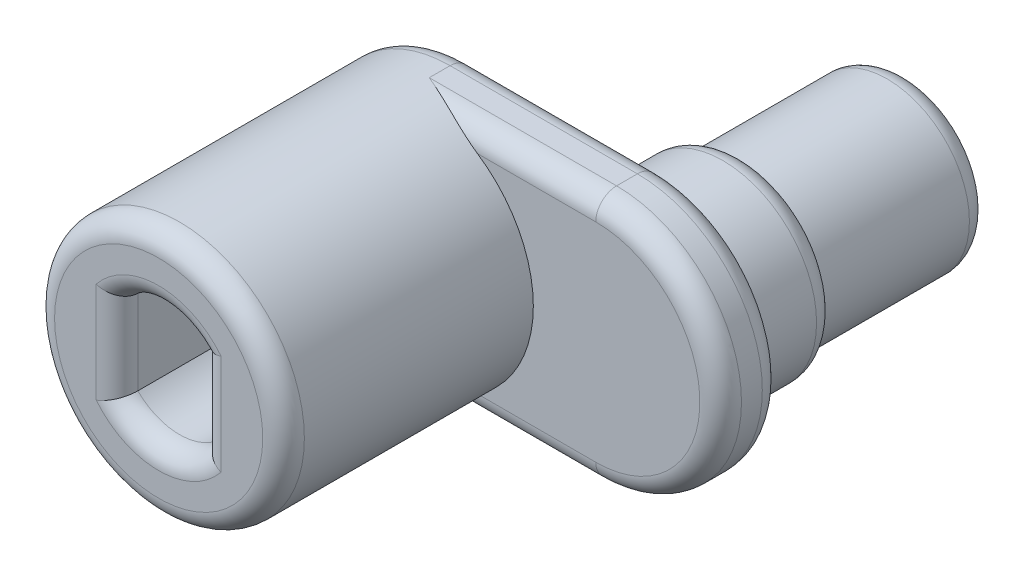
ISO-10303-21;
HEADER;
FILE_DESCRIPTION(('STEP AP214'),'2;1');
FILE_NAME('part.step','',(''),(''),'','','');
FILE_SCHEMA(('AUTOMOTIVE_DESIGN { 1 0 10303 214 1 1 1 1 }'));
ENDSEC;
DATA;
#1=APPLICATION_CONTEXT('core data for automotive mechanical design processes');
#2=APPLICATION_PROTOCOL_DEFINITION('international standard','automotive_design',2000,#1);
#3=PRODUCT_CONTEXT('',#1,'mechanical');
#4=PRODUCT('Part','Part','',(#3));
#5=PRODUCT_RELATED_PRODUCT_CATEGORY('part','',(#4));
#6=PRODUCT_DEFINITION_FORMATION('','',#4);
#7=PRODUCT_DEFINITION_CONTEXT('part definition',#1,'design');
#8=PRODUCT_DEFINITION('design','',#6,#7);
#9=PRODUCT_DEFINITION_SHAPE('','',#8);
#10=(LENGTH_UNIT() NAMED_UNIT(*) SI_UNIT(.MILLI.,.METRE.));
#11=(NAMED_UNIT(*) PLANE_ANGLE_UNIT() SI_UNIT($,.RADIAN.));
#12=(NAMED_UNIT(*) SI_UNIT($,.STERADIAN.) SOLID_ANGLE_UNIT());
#13=UNCERTAINTY_MEASURE_WITH_UNIT(LENGTH_MEASURE(1.E-05),#10,'distance_accuracy_value','');
#14=(GEOMETRIC_REPRESENTATION_CONTEXT(3) GLOBAL_UNCERTAINTY_ASSIGNED_CONTEXT((#13)) GLOBAL_UNIT_ASSIGNED_CONTEXT((#10,
#11,#12)) REPRESENTATION_CONTEXT('',''));
#15=CARTESIAN_POINT('',(0.,0.,0.));
#16=DIRECTION('',(0.,0.,1.));
#17=DIRECTION('',(1.,0.,0.));
#18=AXIS2_PLACEMENT_3D('',#15,#16,#17);
#19=CARTESIAN_POINT('',(-9.,0.,3.));
#20=DIRECTION('',(0.,0.,-1.));
#21=DIRECTION('',(-1.,0.,0.));
#22=AXIS2_PLACEMENT_3D('',#19,#20,#21);
#23=CYLINDRICAL_SURFACE('',#22,2.85);
#24=DIRECTION('',(0.,0.,-1.));
#25=VECTOR('',#24,1.);
#26=CARTESIAN_POINT('',(-11.,-2.03039405042469,3.));
#27=LINE('',#26,#25);
#28=CARTESIAN_POINT('',(-11.,-2.03039405042469,14.));
#29=VERTEX_POINT('',#28);
#30=CARTESIAN_POINT('',(-11.,-2.03039405042469,4.));
#31=VERTEX_POINT('',#30);
#32=EDGE_CURVE('E191',#29,#31,#27,.T.);
#33=ORIENTED_EDGE('',*,*,#32,.F.);
#34=CARTESIAN_POINT('',(-9.,0.,14.));
#35=DIRECTION('',(0.,0.,1.));
#36=DIRECTION('',(1.,0.,0.));
#37=AXIS2_PLACEMENT_3D('',#34,#35,#36);
#38=CIRCLE('',#37,2.85);
#39=CARTESIAN_POINT('',(-7.,-2.0303940504247,14.));
#40=VERTEX_POINT('',#39);
#41=EDGE_CURVE('E256',#29,#40,#38,.T.);
#42=ORIENTED_EDGE('',*,*,#41,.T.);
#43=DIRECTION('',(0.,0.,-1.));
#44=VECTOR('',#43,1.);
#45=CARTESIAN_POINT('',(-7.,-2.0303940504247,3.));
#46=LINE('',#45,#44);
#47=CARTESIAN_POINT('',(-7.,-2.0303940504247,4.));
#48=VERTEX_POINT('',#47);
#49=EDGE_CURVE('E162',#40,#48,#46,.T.);
#50=ORIENTED_EDGE('',*,*,#49,.T.);
#51=CARTESIAN_POINT('',(-9.,0.,4.));
#52=DIRECTION('',(0.,0.,1.));
#53=DIRECTION('',(1.,0.,0.));
#54=AXIS2_PLACEMENT_3D('',#51,#52,#53);
#55=CIRCLE('',#54,2.85);
#56=EDGE_CURVE('E172',#31,#48,#55,.T.);
#57=ORIENTED_EDGE('',*,*,#56,.F.);
#58=EDGE_LOOP('',(#33,#42,#50,#57));
#59=FACE_BOUND('',#58,.T.);
#60=ADVANCED_FACE('F43',(#59),#23,.F.);
#61=CARTESIAN_POINT('',(-11.,0.,3.));
#62=DIRECTION('',(-1.,0.,0.));
#63=DIRECTION('',(0.,0.,1.));
#64=AXIS2_PLACEMENT_3D('',#61,#62,#63);
#65=PLANE('',#64);
#66=DIRECTION('',(0.,0.,-1.));
#67=VECTOR('',#66,1.);
#68=CARTESIAN_POINT('',(-11.,2.03039405042469,3.));
#69=LINE('',#68,#67);
#70=CARTESIAN_POINT('',(-11.,2.03039405042469,14.));
#71=VERTEX_POINT('',#70);
#72=CARTESIAN_POINT('',(-11.,2.03039405042469,4.));
#73=VERTEX_POINT('',#72);
#74=EDGE_CURVE('E158',#71,#73,#69,.T.);
#75=ORIENTED_EDGE('',*,*,#74,.F.);
#76=DIRECTION('',(0.,1.,0.));
#77=VECTOR('',#76,1.);
#78=CARTESIAN_POINT('',(-11.,-2.03039405042469,14.));
#79=LINE('',#78,#77);
#80=EDGE_CURVE('E63',#71,#29,#79,.F.);
#81=ORIENTED_EDGE('',*,*,#80,.T.);
#82=ORIENTED_EDGE('',*,*,#32,.T.);
#83=DIRECTION('',(0.,1.,0.));
#84=VECTOR('',#83,1.);
#85=CARTESIAN_POINT('',(-11.,0.,4.));
#86=LINE('',#85,#84);
#87=EDGE_CURVE('E174',#31,#73,#86,.T.);
#88=ORIENTED_EDGE('',*,*,#87,.T.);
#89=EDGE_LOOP('',(#75,#81,#82,#88));
#90=FACE_BOUND('',#89,.T.);
#91=ADVANCED_FACE('F292',(#90),#65,.F.);
#92=CARTESIAN_POINT('',(-9.,0.,3.));
#93=DIRECTION('',(0.,0.,-1.));
#94=DIRECTION('',(-1.,0.,0.));
#95=AXIS2_PLACEMENT_3D('',#92,#93,#94);
#96=CYLINDRICAL_SURFACE('',#95,2.85);
#97=DIRECTION('',(0.,0.,-1.));
#98=VECTOR('',#97,1.);
#99=CARTESIAN_POINT('',(-7.,2.0303940504247,3.));
#100=LINE('',#99,#98);
#101=CARTESIAN_POINT('',(-7.,2.0303940504247,14.));
#102=VERTEX_POINT('',#101);
#103=CARTESIAN_POINT('',(-7.,2.0303940504247,4.));
#104=VERTEX_POINT('',#103);
#105=EDGE_CURVE('E151',#102,#104,#100,.T.);
#106=ORIENTED_EDGE('',*,*,#105,.F.);
#107=CARTESIAN_POINT('',(-9.,0.,14.));
#108=DIRECTION('',(0.,0.,1.));
#109=DIRECTION('',(1.,0.,0.));
#110=AXIS2_PLACEMENT_3D('',#107,#108,#109);
#111=CIRCLE('',#110,2.85);
#112=EDGE_CURVE('E72',#102,#71,#111,.T.);
#113=ORIENTED_EDGE('',*,*,#112,.T.);
#114=ORIENTED_EDGE('',*,*,#74,.T.);
#115=CARTESIAN_POINT('',(-9.,0.,4.));
#116=DIRECTION('',(0.,0.,1.));
#117=DIRECTION('',(1.,0.,0.));
#118=AXIS2_PLACEMENT_3D('',#115,#116,#117);
#119=CIRCLE('',#118,2.85);
#120=EDGE_CURVE('E161',#104,#73,#119,.T.);
#121=ORIENTED_EDGE('',*,*,#120,.F.);
#122=EDGE_LOOP('',(#106,#113,#114,#121));
#123=FACE_BOUND('',#122,.T.);
#124=ADVANCED_FACE('F163',(#123),#96,.F.);
#125=CARTESIAN_POINT('',(0.,6.,3.));
#126=DIRECTION('',(0.,-1.,0.));
#127=DIRECTION('',(0.,0.,-1.));
#128=AXIS2_PLACEMENT_3D('',#125,#126,#127);
#129=PLANE('',#128);
#130=DIRECTION('',(0.,0.,-1.));
#131=VECTOR('',#130,1.);
#132=CARTESIAN_POINT('',(0.,6.,3.));
#133=LINE('',#132,#131);
#134=CARTESIAN_POINT('',(0.,6.,2.));
#135=VERTEX_POINT('',#134);
#136=CARTESIAN_POINT('',(0.,6.,1.));
#137=VERTEX_POINT('',#136);
#138=EDGE_CURVE('E190',#135,#137,#133,.T.);
#139=ORIENTED_EDGE('',*,*,#138,.T.);
#140=DIRECTION('',(-1.,0.,0.));
#141=VECTOR('',#140,1.);
#142=CARTESIAN_POINT('',(0.,6.,1.));
#143=LINE('',#142,#141);
#144=CARTESIAN_POINT('',(-9.,6.,1.));
#145=VERTEX_POINT('',#144);
#146=EDGE_CURVE('E216',#137,#145,#143,.T.);
#147=ORIENTED_EDGE('',*,*,#146,.T.);
#148=DIRECTION('',(0.,0.,-1.));
#149=VECTOR('',#148,1.);
#150=CARTESIAN_POINT('',(-9.,6.,3.));
#151=LINE('',#150,#149);
#152=CARTESIAN_POINT('',(-9.,6.,2.));
#153=VERTEX_POINT('',#152);
#154=EDGE_CURVE('E186',#153,#145,#151,.T.);
#155=ORIENTED_EDGE('',*,*,#154,.F.);
#156=DIRECTION('',(-1.,0.,0.));
#157=VECTOR('',#156,1.);
#158=CARTESIAN_POINT('',(0.,6.,2.));
#159=LINE('',#158,#157);
#160=EDGE_CURVE('E211',#153,#135,#159,.F.);
#161=ORIENTED_EDGE('',*,*,#160,.T.);
#162=EDGE_LOOP('',(#139,#147,#155,#161));
#163=FACE_BOUND('',#162,.T.);
#164=ADVANCED_FACE('F281',(#163),#129,.F.);
#165=CARTESIAN_POINT('',(-9.,0.,3.));
#166=DIRECTION('',(0.,0.,-1.));
#167=DIRECTION('',(-1.,0.,0.));
#168=AXIS2_PLACEMENT_3D('',#165,#166,#167);
#169=CYLINDRICAL_SURFACE('',#168,6.);
#170=CARTESIAN_POINT('',(-9.,0.,14.));
#171=DIRECTION('',(0.,0.,1.));
#172=DIRECTION('',(1.,0.,0.));
#173=AXIS2_PLACEMENT_3D('',#170,#171,#172);
#174=CIRCLE('',#173,6.);
#175=CARTESIAN_POINT('',(-3.,0.,14.));
#176=VERTEX_POINT('',#175);
#177=EDGE_CURVE('E255',#176,#176,#174,.F.);
#178=ORIENTED_EDGE('',*,*,#177,.T.);
#179=EDGE_LOOP('',(#178));
#180=FACE_BOUND('',#179,.T.);
#181=ORIENTED_EDGE('',*,*,#154,.T.);
#182=CARTESIAN_POINT('',(-9.,0.,1.));
#183=DIRECTION('',(0.,0.,1.));
#184=DIRECTION('',(1.,0.,0.));
#185=AXIS2_PLACEMENT_3D('',#182,#183,#184);
#186=CIRCLE('',#185,6.);
#187=CARTESIAN_POINT('',(-9.,-6.,1.));
#188=VERTEX_POINT('',#187);
#189=EDGE_CURVE('E249',#145,#188,#186,.T.);
#190=ORIENTED_EDGE('',*,*,#189,.T.);
#191=DIRECTION('',(0.,0.,-1.));
#192=VECTOR('',#191,1.);
#193=CARTESIAN_POINT('',(-9.,-6.,3.));
#194=LINE('',#193,#192);
#195=CARTESIAN_POINT('',(-9.,-6.,2.));
#196=VERTEX_POINT('',#195);
#197=EDGE_CURVE('E197',#196,#188,#194,.T.);
#198=ORIENTED_EDGE('',*,*,#197,.F.);
#199=CARTESIAN_POINT('',(-5.68337520964461,-5.,3.));
#200=CARTESIAN_POINT('',(-5.7541107496535,-5.04693073718608,2.99996088985897));
#201=CARTESIAN_POINT('',(-5.82578928514933,-5.09230552866443,2.99670012924773));
#202=CARTESIAN_POINT('',(-5.97055707879883,-5.17972843111877,2.98471287105526));
#203=CARTESIAN_POINT('',(-6.04364391342487,-5.22178171538329,2.97599506979339));
#204=CARTESIAN_POINT('',(-6.19059189468272,-5.3022841991124,2.9541228058013));
#205=CARTESIAN_POINT('',(-6.26444692922391,-5.34075122750363,2.94099197118298));
#206=CARTESIAN_POINT('',(-6.41310840932028,-5.41432119569905,2.91099767206763));
#207=CARTESIAN_POINT('',(-6.48791537667021,-5.44942219177048,2.89413206928888));
#208=CARTESIAN_POINT('',(-6.69893580797272,-5.54321172794869,2.84242522003985));
#209=CARTESIAN_POINT('',(-6.8359981187838,-5.59808248534124,2.80405950269348));
#210=CARTESIAN_POINT('',(-7.11176438315576,-5.69702137805394,2.71998314396154));
#211=CARTESIAN_POINT('',(-7.25046919667064,-5.74108356617588,2.67426848176229));
#212=CARTESIAN_POINT('',(-7.5294273439826,-5.81880111828429,2.5774342802611));
#213=CARTESIAN_POINT('',(-7.6696842677544,-5.85242182237547,2.52629748021286));
#214=CARTESIAN_POINT('',(-7.95085993750273,-5.90930382157744,2.42044575684157));
#215=CARTESIAN_POINT('',(-8.09177838113347,-5.93256945692709,2.36573234367465));
#216=CARTESIAN_POINT('',(-8.35824382334687,-5.96691885342722,2.26035658078792));
#217=CARTESIAN_POINT('',(-8.48374708715462,-5.9790741295418,2.20992564892179));
#218=CARTESIAN_POINT('',(-8.73472825039764,-5.99544962953236,2.10828172718314));
#219=CARTESIAN_POINT('',(-8.86020584499788,-5.99968301433478,2.05707017716895));
#220=CARTESIAN_POINT('',(-8.99043820652584,-5.99999428411862,2.00390358532528));
#221=CARTESIAN_POINT('',(-8.9952191255371,-5.99999999815974,2.00195178315622));
#222=CARTESIAN_POINT('',(-9.,-6.,2.));
#223=B_SPLINE_CURVE_WITH_KNOTS('',3,(#199,#200,#201,#202,#203,#204,#205,#206,#207,#208,#209,
#210,#211,#212,#213,#214,#215,#216,#217,#218,#219,#220,#221,#222),.UNSPECIFIED.,.F.,.F.,(4,2,2,
2,2,2,2,2,2,2,2,4),(0.,0.254478765589245,0.50855302360644,0.761288041690582,1.01416813500991,
1.47107229962261,1.92822730548719,2.38688397976839,2.84534823055555,3.25253093781937,
3.65903657498634,3.6745285178593),.UNSPECIFIED.);
#224=CARTESIAN_POINT('',(-5.68337520964461,-5.,3.));
#225=VERTEX_POINT('',#224);
#226=EDGE_CURVE('E60',#196,#225,#223,.F.);
#227=ORIENTED_EDGE('',*,*,#226,.T.);
#228=CARTESIAN_POINT('',(-9.,0.,3.));
#229=DIRECTION('',(0.,0.,1.));
#230=DIRECTION('',(1.,0.,0.));
#231=AXIS2_PLACEMENT_3D('',#228,#229,#230);
#232=CIRCLE('',#231,6.);
#233=CARTESIAN_POINT('',(-5.68337520964461,5.,3.));
#234=VERTEX_POINT('',#233);
#235=EDGE_CURVE('E182',#234,#225,#232,.F.);
#236=ORIENTED_EDGE('',*,*,#235,.F.);
#237=CARTESIAN_POINT('',(-5.68337520964461,5.,3.));
#238=CARTESIAN_POINT('',(-5.7541107496535,5.04693073718608,2.99996088985897));
#239=CARTESIAN_POINT('',(-5.82578928514933,5.09230552866443,2.99670012924773));
#240=CARTESIAN_POINT('',(-5.97055707879883,5.17972843111877,2.98471287105526));
#241=CARTESIAN_POINT('',(-6.04364391342487,5.22178171538329,2.97599506979339));
#242=CARTESIAN_POINT('',(-6.19059189468272,5.3022841991124,2.9541228058013));
#243=CARTESIAN_POINT('',(-6.26444692922391,5.34075122750363,2.94099197118298));
#244=CARTESIAN_POINT('',(-6.41310840932028,5.41432119569905,2.91099767206763));
#245=CARTESIAN_POINT('',(-6.48791537667021,5.44942219177048,2.89413206928888));
#246=CARTESIAN_POINT('',(-6.69893580797272,5.54321172794869,2.84242522003985));
#247=CARTESIAN_POINT('',(-6.8359981187838,5.59808248534124,2.80405950269348));
#248=CARTESIAN_POINT('',(-7.11176438315576,5.69702137805394,2.71998314396154));
#249=CARTESIAN_POINT('',(-7.25046919667064,5.74108356617588,2.67426848176229));
#250=CARTESIAN_POINT('',(-7.5294273439826,5.81880111828429,2.5774342802611));
#251=CARTESIAN_POINT('',(-7.6696842677544,5.85242182237547,2.52629748021286));
#252=CARTESIAN_POINT('',(-7.95085993750273,5.90930382157744,2.42044575684157));
#253=CARTESIAN_POINT('',(-8.09177838113347,5.93256945692709,2.36573234367465));
#254=CARTESIAN_POINT('',(-8.35824382334687,5.96691885342722,2.26035658078792));
#255=CARTESIAN_POINT('',(-8.48374708715462,5.9790741295418,2.20992564892179));
#256=CARTESIAN_POINT('',(-8.73472825039764,5.99544962953236,2.10828172718314));
#257=CARTESIAN_POINT('',(-8.86020584499788,5.99968301433478,2.05707017716895));
#258=CARTESIAN_POINT('',(-8.99043820652584,5.99999428411862,2.00390358532528));
#259=CARTESIAN_POINT('',(-8.9952191255371,5.99999999815974,2.00195178315622));
#260=CARTESIAN_POINT('',(-9.,6.,2.));
#261=B_SPLINE_CURVE_WITH_KNOTS('',3,(#237,#238,#239,#240,#241,#242,#243,#244,#245,#246,#247,
#248,#249,#250,#251,#252,#253,#254,#255,#256,#257,#258,#259,#260),.UNSPECIFIED.,.F.,.F.,(4,2,2,
2,2,2,2,2,2,2,2,4),(0.,0.254478765589245,0.50855302360644,0.761288041690582,1.01416813500991,
1.47107229962261,1.92822730548719,2.38688397976839,2.84534823055555,3.25253093781937,
3.65903657498634,3.6745285178593),.UNSPECIFIED.);
#262=EDGE_CURVE('E11',#234,#153,#261,.T.);
#263=ORIENTED_EDGE('',*,*,#262,.T.);
#264=EDGE_LOOP('',(#181,#190,#198,#227,#236,#263));
#265=FACE_BOUND('',#264,.T.);
#266=ADVANCED_FACE('F278',(#180,#265),#169,.T.);
#267=CARTESIAN_POINT('',(0.,-6.,3.));
#268=DIRECTION('',(0.,1.,0.));
#269=DIRECTION('',(0.,0.,1.));
#270=AXIS2_PLACEMENT_3D('',#267,#268,#269);
#271=PLANE('',#270);
#272=DIRECTION('',(0.,0.,-1.));
#273=VECTOR('',#272,1.);
#274=CARTESIAN_POINT('',(0.,-6.,3.));
#275=LINE('',#274,#273);
#276=CARTESIAN_POINT('',(0.,-6.,2.));
#277=VERTEX_POINT('',#276);
#278=CARTESIAN_POINT('',(0.,-6.,1.));
#279=VERTEX_POINT('',#278);
#280=EDGE_CURVE('E196',#277,#279,#275,.T.);
#281=ORIENTED_EDGE('',*,*,#280,.F.);
#282=DIRECTION('',(1.,0.,0.));
#283=VECTOR('',#282,1.);
#284=CARTESIAN_POINT('',(-9.,-6.,2.));
#285=LINE('',#284,#283);
#286=EDGE_CURVE('E215',#277,#196,#285,.F.);
#287=ORIENTED_EDGE('',*,*,#286,.T.);
#288=ORIENTED_EDGE('',*,*,#197,.T.);
#289=DIRECTION('',(1.,0.,0.));
#290=VECTOR('',#289,1.);
#291=CARTESIAN_POINT('',(0.,-6.,1.));
#292=LINE('',#291,#290);
#293=EDGE_CURVE('E208',#188,#279,#292,.T.);
#294=ORIENTED_EDGE('',*,*,#293,.T.);
#295=EDGE_LOOP('',(#281,#287,#288,#294));
#296=FACE_BOUND('',#295,.T.);
#297=ADVANCED_FACE('F284',(#296),#271,.F.);
#298=CARTESIAN_POINT('',(0.,0.,3.));
#299=DIRECTION('',(0.,0.,-1.));
#300=DIRECTION('',(-1.,0.,0.));
#301=AXIS2_PLACEMENT_3D('',#298,#299,#300);
#302=CYLINDRICAL_SURFACE('',#301,6.);
#303=ORIENTED_EDGE('',*,*,#280,.T.);
#304=CARTESIAN_POINT('',(0.,0.,1.));
#305=DIRECTION('',(0.,0.,1.));
#306=DIRECTION('',(1.,0.,0.));
#307=AXIS2_PLACEMENT_3D('',#304,#305,#306);
#308=CIRCLE('',#307,6.);
#309=EDGE_CURVE('E229',#279,#137,#308,.T.);
#310=ORIENTED_EDGE('',*,*,#309,.T.);
#311=ORIENTED_EDGE('',*,*,#138,.F.);
#312=CARTESIAN_POINT('',(0.,0.,2.));
#313=DIRECTION('',(0.,0.,1.));
#314=DIRECTION('',(1.,0.,0.));
#315=AXIS2_PLACEMENT_3D('',#312,#313,#314);
#316=CIRCLE('',#315,6.);
#317=EDGE_CURVE('E227',#135,#277,#316,.F.);
#318=ORIENTED_EDGE('',*,*,#317,.T.);
#319=EDGE_LOOP('',(#303,#310,#311,#318));
#320=FACE_BOUND('',#319,.T.);
#321=ADVANCED_FACE('F302',(#320),#302,.T.);
#322=CARTESIAN_POINT('',(-7.,0.,3.));
#323=DIRECTION('',(-1.,0.,0.));
#324=DIRECTION('',(0.,0.,1.));
#325=AXIS2_PLACEMENT_3D('',#322,#323,#324);
#326=PLANE('',#325);
#327=ORIENTED_EDGE('',*,*,#49,.F.);
#328=DIRECTION('',(0.,1.,0.));
#329=VECTOR('',#328,1.);
#330=CARTESIAN_POINT('',(-7.,0.,14.));
#331=LINE('',#330,#329);
#332=EDGE_CURVE('E159',#40,#102,#331,.T.);
#333=ORIENTED_EDGE('',*,*,#332,.T.);
#334=ORIENTED_EDGE('',*,*,#105,.T.);
#335=DIRECTION('',(0.,1.,0.));
#336=VECTOR('',#335,1.);
#337=CARTESIAN_POINT('',(-7.,0.,4.));
#338=LINE('',#337,#336);
#339=EDGE_CURVE('E157',#48,#104,#338,.T.);
#340=ORIENTED_EDGE('',*,*,#339,.F.);
#341=EDGE_LOOP('',(#327,#333,#334,#340));
#342=FACE_BOUND('',#341,.T.);
#343=ADVANCED_FACE('F153',(#342),#326,.T.);
#344=CARTESIAN_POINT('',(0.,0.,3.));
#345=DIRECTION('',(0.,0.,1.));
#346=DIRECTION('',(1.,0.,0.));
#347=AXIS2_PLACEMENT_3D('',#344,#345,#346);
#348=PLANE('',#347);
#349=ORIENTED_EDGE('',*,*,#235,.T.);
#350=DIRECTION('',(1.,0.,0.));
#351=VECTOR('',#350,1.);
#352=CARTESIAN_POINT('',(0.,-5.,3.));
#353=LINE('',#352,#351);
#354=CARTESIAN_POINT('',(0.,-5.,3.));
#355=VERTEX_POINT('',#354);
#356=EDGE_CURVE('E210',#225,#355,#353,.T.);
#357=ORIENTED_EDGE('',*,*,#356,.T.);
#358=CARTESIAN_POINT('',(0.,0.,3.));
#359=DIRECTION('',(0.,0.,1.));
#360=DIRECTION('',(1.,0.,0.));
#361=AXIS2_PLACEMENT_3D('',#358,#359,#360);
#362=CIRCLE('',#361,5.);
#363=CARTESIAN_POINT('',(0.,5.,3.));
#364=VERTEX_POINT('',#363);
#365=EDGE_CURVE('E204',#355,#364,#362,.T.);
#366=ORIENTED_EDGE('',*,*,#365,.T.);
#367=DIRECTION('',(-1.,0.,0.));
#368=VECTOR('',#367,1.);
#369=CARTESIAN_POINT('',(-9.,5.,3.));
#370=LINE('',#369,#368);
#371=EDGE_CURVE('E193',#364,#234,#370,.T.);
#372=ORIENTED_EDGE('',*,*,#371,.T.);
#373=EDGE_LOOP('',(#349,#357,#366,#372));
#374=FACE_BOUND('',#373,.T.);
#375=ADVANCED_FACE('F308',(#374),#348,.T.);
#376=CARTESIAN_POINT('',(0.,0.,0.));
#377=DIRECTION('',(0.,0.,1.));
#378=DIRECTION('',(1.,0.,0.));
#379=AXIS2_PLACEMENT_3D('',#376,#377,#378);
#380=PLANE('',#379);
#381=CARTESIAN_POINT('',(-9.,0.,0.));
#382=DIRECTION('',(0.,0.,1.));
#383=DIRECTION('',(1.,0.,0.));
#384=AXIS2_PLACEMENT_3D('',#381,#382,#383);
#385=CIRCLE('',#384,5.);
#386=CARTESIAN_POINT('',(-9.,-5.,0.));
#387=VERTEX_POINT('',#386);
#388=CARTESIAN_POINT('',(-9.,5.,0.));
#389=VERTEX_POINT('',#388);
#390=EDGE_CURVE('E218',#387,#389,#385,.F.);
#391=ORIENTED_EDGE('',*,*,#390,.T.);
#392=DIRECTION('',(-1.,0.,0.));
#393=VECTOR('',#392,1.);
#394=CARTESIAN_POINT('',(0.,5.,0.));
#395=LINE('',#394,#393);
#396=CARTESIAN_POINT('',(0.,5.,0.));
#397=VERTEX_POINT('',#396);
#398=EDGE_CURVE('E224',#389,#397,#395,.F.);
#399=ORIENTED_EDGE('',*,*,#398,.T.);
#400=CARTESIAN_POINT('',(0.,0.,0.));
#401=DIRECTION('',(0.,0.,1.));
#402=DIRECTION('',(1.,0.,0.));
#403=AXIS2_PLACEMENT_3D('',#400,#401,#402);
#404=CIRCLE('',#403,5.);
#405=CARTESIAN_POINT('',(0.,-5.,0.));
#406=VERTEX_POINT('',#405);
#407=EDGE_CURVE('E222',#397,#406,#404,.F.);
#408=ORIENTED_EDGE('',*,*,#407,.T.);
#409=DIRECTION('',(1.,0.,0.));
#410=VECTOR('',#409,1.);
#411=CARTESIAN_POINT('',(0.,-5.,0.));
#412=LINE('',#411,#410);
#413=EDGE_CURVE('E221',#406,#387,#412,.F.);
#414=ORIENTED_EDGE('',*,*,#413,.T.);
#415=EDGE_LOOP('',(#391,#399,#408,#414));
#416=FACE_BOUND('',#415,.T.);
#417=CARTESIAN_POINT('',(0.,0.,0.));
#418=DIRECTION('',(0.,0.,1.));
#419=DIRECTION('',(1.,0.,0.));
#420=AXIS2_PLACEMENT_3D('',#417,#418,#419);
#421=CIRCLE('',#420,4.5);
#422=CARTESIAN_POINT('',(4.5,0.,0.));
#423=VERTEX_POINT('',#422);
#424=EDGE_CURVE('E168',#423,#423,#421,.T.);
#425=ORIENTED_EDGE('',*,*,#424,.T.);
#426=EDGE_LOOP('',(#425));
#427=FACE_BOUND('',#426,.T.);
#428=ADVANCED_FACE('F439',(#416,#427),#380,.F.);
#429=CARTESIAN_POINT('',(0.,0.,15.));
#430=DIRECTION('',(0.,0.,1.));
#431=DIRECTION('',(1.,0.,0.));
#432=AXIS2_PLACEMENT_3D('',#429,#430,#431);
#433=PLANE('',#432);
#434=CARTESIAN_POINT('',(-9.,0.,15.));
#435=DIRECTION('',(0.,0.,1.));
#436=DIRECTION('',(1.,0.,0.));
#437=AXIS2_PLACEMENT_3D('',#434,#435,#436);
#438=CIRCLE('',#437,5.);
#439=CARTESIAN_POINT('',(-4.,0.,15.));
#440=VERTEX_POINT('',#439);
#441=EDGE_CURVE('E250',#440,#440,#438,.T.);
#442=ORIENTED_EDGE('',*,*,#441,.T.);
#443=EDGE_LOOP('',(#442));
#444=FACE_BOUND('',#443,.T.);
#445=CARTESIAN_POINT('',(-9.,0.,15.));
#446=DIRECTION('',(0.,0.,1.));
#447=DIRECTION('',(1.,0.,0.));
#448=AXIS2_PLACEMENT_3D('',#445,#446,#447);
#449=CIRCLE('',#448,3.85);
#450=CARTESIAN_POINT('',(-12.,2.41298570240273,15.));
#451=VERTEX_POINT('',#450);
#452=CARTESIAN_POINT('',(-6.,2.41298570240273,15.));
#453=VERTEX_POINT('',#452);
#454=EDGE_CURVE('E245',#451,#453,#449,.F.);
#455=ORIENTED_EDGE('',*,*,#454,.T.);
#456=DIRECTION('',(0.,1.,0.));
#457=VECTOR('',#456,1.);
#458=CARTESIAN_POINT('',(-6.,0.,15.));
#459=LINE('',#458,#457);
#460=CARTESIAN_POINT('',(-6.,-2.41298570240273,15.));
#461=VERTEX_POINT('',#460);
#462=EDGE_CURVE('E243',#453,#461,#459,.F.);
#463=ORIENTED_EDGE('',*,*,#462,.T.);
#464=CARTESIAN_POINT('',(-9.,0.,15.));
#465=DIRECTION('',(0.,0.,1.));
#466=DIRECTION('',(1.,0.,0.));
#467=AXIS2_PLACEMENT_3D('',#464,#465,#466);
#468=CIRCLE('',#467,3.85);
#469=CARTESIAN_POINT('',(-12.,-2.41298570240273,15.));
#470=VERTEX_POINT('',#469);
#471=EDGE_CURVE('E239',#461,#470,#468,.F.);
#472=ORIENTED_EDGE('',*,*,#471,.T.);
#473=DIRECTION('',(0.,1.,0.));
#474=VECTOR('',#473,1.);
#475=CARTESIAN_POINT('',(-12.,2.03039405042469,15.));
#476=LINE('',#475,#474);
#477=EDGE_CURVE('E238',#470,#451,#476,.T.);
#478=ORIENTED_EDGE('',*,*,#477,.T.);
#479=EDGE_LOOP('',(#455,#463,#472,#478));
#480=FACE_BOUND('',#479,.T.);
#481=ADVANCED_FACE('F412',(#444,#480),#433,.T.);
#482=CARTESIAN_POINT('',(0.,0.,-4.));
#483=DIRECTION('',(0.,0.,1.));
#484=DIRECTION('',(1.,0.,0.));
#485=AXIS2_PLACEMENT_3D('',#482,#483,#484);
#486=CYLINDRICAL_SURFACE('',#485,4.5);
#487=CARTESIAN_POINT('',(0.,0.,-3.10697144502541));
#488=DIRECTION('',(0.,0.,-1.));
#489=DIRECTION('',(-1.,0.,0.));
#490=AXIS2_PLACEMENT_3D('',#487,#488,#489);
#491=CIRCLE('',#490,4.5);
#492=CARTESIAN_POINT('',(-4.5,0.,-3.10697144502541));
#493=VERTEX_POINT('',#492);
#494=EDGE_CURVE('E259',#493,#493,#491,.F.);
#495=ORIENTED_EDGE('',*,*,#494,.T.);
#496=EDGE_LOOP('',(#495));
#497=FACE_BOUND('',#496,.T.);
#498=ORIENTED_EDGE('',*,*,#424,.F.);
#499=EDGE_LOOP('',(#498));
#500=FACE_BOUND('',#499,.T.);
#501=ADVANCED_FACE('F432',(#497,#500),#486,.T.);
#502=CARTESIAN_POINT('',(0.,0.,-12.));
#503=DIRECTION('',(0.,0.,1.));
#504=DIRECTION('',(1.,0.,0.));
#505=AXIS2_PLACEMENT_3D('',#502,#503,#504);
#506=PLANE('',#505);
#507=CARTESIAN_POINT('',(0.,0.,-12.));
#508=DIRECTION('',(0.,0.,1.));
#509=DIRECTION('',(1.,0.,0.));
#510=AXIS2_PLACEMENT_3D('',#507,#508,#509);
#511=CIRCLE('',#510,2.95);
#512=CARTESIAN_POINT('',(2.95,0.,-12.));
#513=VERTEX_POINT('',#512);
#514=EDGE_CURVE('E233',#513,#513,#511,.F.);
#515=ORIENTED_EDGE('',*,*,#514,.T.);
#516=EDGE_LOOP('',(#515));
#517=FACE_BOUND('',#516,.T.);
#518=ADVANCED_FACE('F431',(#517),#506,.F.);
#519=CARTESIAN_POINT('',(0.,0.,-12.));
#520=DIRECTION('',(0.,0.,1.));
#521=DIRECTION('',(1.,0.,0.));
#522=AXIS2_PLACEMENT_3D('',#519,#520,#521);
#523=CYLINDRICAL_SURFACE('',#522,3.95);
#524=CARTESIAN_POINT('',(0.,0.,-11.));
#525=DIRECTION('',(0.,0.,1.));
#526=DIRECTION('',(1.,0.,0.));
#527=AXIS2_PLACEMENT_3D('',#524,#525,#526);
#528=CIRCLE('',#527,3.95);
#529=CARTESIAN_POINT('',(3.95,0.,-11.));
#530=VERTEX_POINT('',#529);
#531=EDGE_CURVE('E235',#530,#530,#528,.T.);
#532=ORIENTED_EDGE('',*,*,#531,.T.);
#533=EDGE_LOOP('',(#532));
#534=FACE_BOUND('',#533,.T.);
#535=CARTESIAN_POINT('',(0.,0.,-4.));
#536=DIRECTION('',(0.,0.,1.));
#537=DIRECTION('',(1.,0.,0.));
#538=AXIS2_PLACEMENT_3D('',#535,#536,#537);
#539=CIRCLE('',#538,3.95);
#540=CARTESIAN_POINT('',(3.95,0.,-4.));
#541=VERTEX_POINT('',#540);
#542=EDGE_CURVE('E178',#541,#541,#539,.T.);
#543=ORIENTED_EDGE('',*,*,#542,.F.);
#544=EDGE_LOOP('',(#543));
#545=FACE_BOUND('',#544,.T.);
#546=ADVANCED_FACE('F451',(#534,#545),#523,.T.);
#547=CARTESIAN_POINT('',(0.,0.,4.));
#548=DIRECTION('',(0.,0.,1.));
#549=DIRECTION('',(1.,0.,0.));
#550=AXIS2_PLACEMENT_3D('',#547,#548,#549);
#551=PLANE('',#550);
#552=ORIENTED_EDGE('',*,*,#87,.F.);
#553=ORIENTED_EDGE('',*,*,#56,.T.);
#554=ORIENTED_EDGE('',*,*,#339,.T.);
#555=ORIENTED_EDGE('',*,*,#120,.T.);
#556=EDGE_LOOP('',(#552,#553,#554,#555));
#557=FACE_BOUND('',#556,.T.);
#558=ADVANCED_FACE('F171',(#557),#551,.T.);
#559=CARTESIAN_POINT('',(0.,5.,2.));
#560=DIRECTION('',(1.,0.,0.));
#561=DIRECTION('',(0.,0.,-1.));
#562=AXIS2_PLACEMENT_3D('',#559,#560,#561);
#563=CYLINDRICAL_SURFACE('',#562,1.);
#564=ORIENTED_EDGE('',*,*,#262,.F.);
#565=ORIENTED_EDGE('',*,*,#371,.F.);
#566=CARTESIAN_POINT('',(0.,5.,2.));
#567=DIRECTION('',(1.,0.,0.));
#568=DIRECTION('',(0.,0.,-1.));
#569=AXIS2_PLACEMENT_3D('',#566,#567,#568);
#570=CIRCLE('',#569,1.);
#571=EDGE_CURVE('E353',#135,#364,#570,.T.);
#572=ORIENTED_EDGE('',*,*,#571,.F.);
#573=ORIENTED_EDGE('',*,*,#160,.F.);
#574=EDGE_LOOP('',(#564,#565,#572,#573));
#575=FACE_BOUND('',#574,.T.);
#576=ADVANCED_FACE('F351',(#575),#563,.T.);
#577=CARTESIAN_POINT('',(0.,0.,2.));
#578=DIRECTION('',(0.,0.,1.));
#579=DIRECTION('',(1.,0.,0.));
#580=AXIS2_PLACEMENT_3D('',#577,#578,#579);
#581=TOROIDAL_SURFACE('',#580,5.,1.);
#582=ORIENTED_EDGE('',*,*,#571,.T.);
#583=ORIENTED_EDGE('',*,*,#365,.F.);
#584=CARTESIAN_POINT('',(0.,-5.,2.));
#585=DIRECTION('',(-1.,0.,0.));
#586=DIRECTION('',(0.,0.,1.));
#587=AXIS2_PLACEMENT_3D('',#584,#585,#586);
#588=CIRCLE('',#587,1.);
#589=EDGE_CURVE('E328',#277,#355,#588,.T.);
#590=ORIENTED_EDGE('',*,*,#589,.F.);
#591=ORIENTED_EDGE('',*,*,#317,.F.);
#592=EDGE_LOOP('',(#582,#583,#590,#591));
#593=FACE_BOUND('',#592,.T.);
#594=ADVANCED_FACE('F356',(#593),#581,.T.);
#595=CARTESIAN_POINT('',(0.,-5.,2.));
#596=DIRECTION('',(-1.,0.,0.));
#597=DIRECTION('',(0.,0.,1.));
#598=AXIS2_PLACEMENT_3D('',#595,#596,#597);
#599=CYLINDRICAL_SURFACE('',#598,1.);
#600=ORIENTED_EDGE('',*,*,#226,.F.);
#601=ORIENTED_EDGE('',*,*,#286,.F.);
#602=ORIENTED_EDGE('',*,*,#589,.T.);
#603=ORIENTED_EDGE('',*,*,#356,.F.);
#604=EDGE_LOOP('',(#600,#601,#602,#603));
#605=FACE_BOUND('',#604,.T.);
#606=ADVANCED_FACE('F274',(#605),#599,.T.);
#607=CARTESIAN_POINT('',(0.,-5.,1.));
#608=DIRECTION('',(1.,0.,0.));
#609=DIRECTION('',(0.,0.,-1.));
#610=AXIS2_PLACEMENT_3D('',#607,#608,#609);
#611=CYLINDRICAL_SURFACE('',#610,1.);
#612=CARTESIAN_POINT('',(-9.,-5.,1.));
#613=DIRECTION('',(-1.,0.,0.));
#614=DIRECTION('',(0.,0.,1.));
#615=AXIS2_PLACEMENT_3D('',#612,#613,#614);
#616=CIRCLE('',#615,1.);
#617=EDGE_CURVE('E329',#387,#188,#616,.T.);
#618=ORIENTED_EDGE('',*,*,#617,.F.);
#619=ORIENTED_EDGE('',*,*,#413,.F.);
#620=CARTESIAN_POINT('',(0.,-5.,1.));
#621=DIRECTION('',(1.,0.,0.));
#622=DIRECTION('',(0.,0.,-1.));
#623=AXIS2_PLACEMENT_3D('',#620,#621,#622);
#624=CIRCLE('',#623,1.);
#625=EDGE_CURVE('E322',#279,#406,#624,.T.);
#626=ORIENTED_EDGE('',*,*,#625,.F.);
#627=ORIENTED_EDGE('',*,*,#293,.F.);
#628=EDGE_LOOP('',(#618,#619,#626,#627));
#629=FACE_BOUND('',#628,.T.);
#630=ADVANCED_FACE('F324',(#629),#611,.T.);
#631=CARTESIAN_POINT('',(0.,0.,1.));
#632=DIRECTION('',(0.,0.,1.));
#633=DIRECTION('',(1.,0.,0.));
#634=AXIS2_PLACEMENT_3D('',#631,#632,#633);
#635=TOROIDAL_SURFACE('',#634,5.,1.);
#636=ORIENTED_EDGE('',*,*,#625,.T.);
#637=ORIENTED_EDGE('',*,*,#407,.F.);
#638=CARTESIAN_POINT('',(0.,5.,1.));
#639=DIRECTION('',(-1.,0.,0.));
#640=DIRECTION('',(0.,0.,1.));
#641=AXIS2_PLACEMENT_3D('',#638,#639,#640);
#642=CIRCLE('',#641,1.);
#643=EDGE_CURVE('E335',#137,#397,#642,.T.);
#644=ORIENTED_EDGE('',*,*,#643,.F.);
#645=ORIENTED_EDGE('',*,*,#309,.F.);
#646=EDGE_LOOP('',(#636,#637,#644,#645));
#647=FACE_BOUND('',#646,.T.);
#648=ADVANCED_FACE('F331',(#647),#635,.T.);
#649=CARTESIAN_POINT('',(-9.,0.,1.));
#650=DIRECTION('',(0.,0.,1.));
#651=DIRECTION('',(1.,0.,0.));
#652=AXIS2_PLACEMENT_3D('',#649,#650,#651);
#653=TOROIDAL_SURFACE('',#652,5.,1.);
#654=ORIENTED_EDGE('',*,*,#617,.T.);
#655=ORIENTED_EDGE('',*,*,#189,.F.);
#656=CARTESIAN_POINT('',(-9.,5.,1.));
#657=DIRECTION('',(1.,0.,0.));
#658=DIRECTION('',(0.,0.,-1.));
#659=AXIS2_PLACEMENT_3D('',#656,#657,#658);
#660=CIRCLE('',#659,1.);
#661=EDGE_CURVE('E336',#389,#145,#660,.T.);
#662=ORIENTED_EDGE('',*,*,#661,.F.);
#663=ORIENTED_EDGE('',*,*,#390,.F.);
#664=EDGE_LOOP('',(#654,#655,#662,#663));
#665=FACE_BOUND('',#664,.T.);
#666=ADVANCED_FACE('F467',(#665),#653,.T.);
#667=CARTESIAN_POINT('',(0.,5.,1.));
#668=DIRECTION('',(-1.,0.,0.));
#669=DIRECTION('',(0.,0.,1.));
#670=AXIS2_PLACEMENT_3D('',#667,#668,#669);
#671=CYLINDRICAL_SURFACE('',#670,1.);
#672=ORIENTED_EDGE('',*,*,#643,.T.);
#673=ORIENTED_EDGE('',*,*,#398,.F.);
#674=ORIENTED_EDGE('',*,*,#661,.T.);
#675=ORIENTED_EDGE('',*,*,#146,.F.);
#676=EDGE_LOOP('',(#672,#673,#674,#675));
#677=FACE_BOUND('',#676,.T.);
#678=ADVANCED_FACE('F337',(#677),#671,.T.);
#679=CARTESIAN_POINT('',(0.,0.,-11.));
#680=DIRECTION('',(0.,0.,1.));
#681=DIRECTION('',(1.,0.,0.));
#682=AXIS2_PLACEMENT_3D('',#679,#680,#681);
#683=TOROIDAL_SURFACE('',#682,2.95,1.);
#684=ORIENTED_EDGE('',*,*,#514,.F.);
#685=EDGE_LOOP('',(#684));
#686=FACE_BOUND('',#685,.T.);
#687=ORIENTED_EDGE('',*,*,#531,.F.);
#688=EDGE_LOOP('',(#687));
#689=FACE_BOUND('',#688,.T.);
#690=ADVANCED_FACE('F404',(#686,#689),#683,.T.);
#691=CARTESIAN_POINT('',(-9.,0.,14.));
#692=DIRECTION('',(0.,0.,1.));
#693=DIRECTION('',(1.,0.,0.));
#694=AXIS2_PLACEMENT_3D('',#691,#692,#693);
#695=TOROIDAL_SURFACE('',#694,5.,1.);
#696=ORIENTED_EDGE('',*,*,#177,.F.);
#697=EDGE_LOOP('',(#696));
#698=FACE_BOUND('',#697,.T.);
#699=ORIENTED_EDGE('',*,*,#441,.F.);
#700=EDGE_LOOP('',(#699));
#701=FACE_BOUND('',#700,.T.);
#702=ADVANCED_FACE('F400',(#698,#701),#695,.T.);
#703=CARTESIAN_POINT('',(-12.,0.,14.));
#704=DIRECTION('',(0.,-1.,0.));
#705=DIRECTION('',(0.,0.,-1.));
#706=AXIS2_PLACEMENT_3D('',#703,#704,#705);
#707=CYLINDRICAL_SURFACE('',#706,1.);
#708=CARTESIAN_POINT('',(-11.,2.03039405042469,14.));
#709=CARTESIAN_POINT('',(-10.999999087712,2.03039318498655,14.0266425518888));
#710=CARTESIAN_POINT('',(-11.0010654808462,2.03084014755129,14.0532716309407));
#711=CARTESIAN_POINT('',(-11.005312449044,2.03261711956964,14.1063248648634));
#712=CARTESIAN_POINT('',(-11.008492531917,2.03394692344599,14.1327490659929));
#713=CARTESIAN_POINT('',(-11.021140816024,2.03922838700597,14.2112636622232));
#714=CARTESIAN_POINT('',(-11.0337174193655,2.0444723107674,14.2628042536247));
#715=CARTESIAN_POINT('',(-11.0666538203122,2.05811982294467,14.3628238860397));
#716=CARTESIAN_POINT('',(-11.0870104223343,2.06652211405871,14.4113041745388));
#717=CARTESIAN_POINT('',(-11.1347666606613,2.08607250738476,14.5040773077458));
#718=CARTESIAN_POINT('',(-11.1621696517581,2.09722191739649,14.5483681440748));
#719=CARTESIAN_POINT('',(-11.2242018888327,2.1222168352535,14.6332437061908));
#720=CARTESIAN_POINT('',(-11.2590518208232,2.13614353048135,14.6736427439609));
#721=CARTESIAN_POINT('',(-11.3342931154528,2.16587608633321,14.7480891340227));
#722=CARTESIAN_POINT('',(-11.3746863748423,2.18168258991981,14.7821343027718));
#723=CARTESIAN_POINT('',(-11.4629793280846,2.21582405761808,14.8454384162373));
#724=CARTESIAN_POINT('',(-11.5112088279664,2.23425893679999,14.8741833366554));
#725=CARTESIAN_POINT('',(-11.6114852269547,2.27208767511543,14.9231297352573));
#726=CARTESIAN_POINT('',(-11.6635327596529,2.2914816932406,14.9433297916643));
#727=CARTESIAN_POINT('',(-11.7615741819515,2.32754125374855,14.9722837541672));
#728=CARTESIAN_POINT('',(-11.8072096201037,2.34414863039289,14.9823493818345));
#729=CARTESIAN_POINT('',(-11.8993795417777,2.37733452151897,14.9960110766301));
#730=CARTESIAN_POINT('',(-11.9459119814808,2.39391302504983,14.999620417261));
#731=CARTESIAN_POINT('',(-11.9949769395256,2.41121579268572,14.9999905614583));
#732=CARTESIAN_POINT('',(-11.9974884763461,2.41210099530568,15.000000025417));
#733=CARTESIAN_POINT('',(-12.,2.41298570240273,15.));
#734=B_SPLINE_CURVE_WITH_KNOTS('',3,(#708,#709,#710,#711,#712,#713,#714,#715,#716,#717,#718,
#719,#720,#721,#722,#723,#724,#725,#726,#727,#728,#729,#730,#731,#732,#733),.UNSPECIFIED.,.F.,
.F.,(4,2,2,2,2,2,2,2,2,2,2,2,4),(0.,0.0798761894091002,0.159733785475283,0.31883268082526,
0.477866297466523,0.6369757707951,0.801694167331105,0.966469066446765,1.1429871417033,
1.3195345761943,1.46792428012884,1.61600855699648,1.62399743398392),.UNSPECIFIED.);
#735=EDGE_CURVE('E389',#451,#71,#734,.F.);
#736=ORIENTED_EDGE('',*,*,#735,.F.);
#737=ORIENTED_EDGE('',*,*,#477,.F.);
#738=CARTESIAN_POINT('',(-11.,-2.03039405042469,14.));
#739=CARTESIAN_POINT('',(-10.999999087712,-2.03039318498655,14.0266425518888));
#740=CARTESIAN_POINT('',(-11.0010654808462,-2.03084014755129,14.0532716309407));
#741=CARTESIAN_POINT('',(-11.005312449044,-2.03261711956964,14.1063248648634));
#742=CARTESIAN_POINT('',(-11.008492531917,-2.03394692344599,14.1327490659929));
#743=CARTESIAN_POINT('',(-11.021140816024,-2.03922838700597,14.2112636622232));
#744=CARTESIAN_POINT('',(-11.0337174193655,-2.0444723107674,14.2628042536247));
#745=CARTESIAN_POINT('',(-11.0666538203122,-2.05811982294467,14.3628238860397));
#746=CARTESIAN_POINT('',(-11.0870104223343,-2.06652211405871,14.4113041745388));
#747=CARTESIAN_POINT('',(-11.1347666606613,-2.08607250738476,14.5040773077458));
#748=CARTESIAN_POINT('',(-11.1621696517581,-2.09722191739649,14.5483681440748));
#749=CARTESIAN_POINT('',(-11.2242018888327,-2.1222168352535,14.6332437061908));
#750=CARTESIAN_POINT('',(-11.2590518208232,-2.13614353048135,14.6736427439609));
#751=CARTESIAN_POINT('',(-11.3342931154528,-2.16587608633321,14.7480891340227));
#752=CARTESIAN_POINT('',(-11.3746863748423,-2.18168258991981,14.7821343027718));
#753=CARTESIAN_POINT('',(-11.4629793280846,-2.21582405761808,14.8454384162373));
#754=CARTESIAN_POINT('',(-11.5112088279664,-2.23425893679999,14.8741833366554));
#755=CARTESIAN_POINT('',(-11.6114852269547,-2.27208767511543,14.9231297352573));
#756=CARTESIAN_POINT('',(-11.6635327596529,-2.2914816932406,14.9433297916643));
#757=CARTESIAN_POINT('',(-11.7615741819515,-2.32754125374855,14.9722837541672));
#758=CARTESIAN_POINT('',(-11.8072096201037,-2.34414863039289,14.9823493818345));
#759=CARTESIAN_POINT('',(-11.8993795417777,-2.37733452151897,14.9960110766301));
#760=CARTESIAN_POINT('',(-11.9459119814808,-2.39391302504983,14.999620417261));
#761=CARTESIAN_POINT('',(-11.9949769395256,-2.41121579268572,14.9999905614583));
#762=CARTESIAN_POINT('',(-11.9974884763461,-2.41210099530568,15.000000025417));
#763=CARTESIAN_POINT('',(-12.,-2.41298570240273,15.));
#764=B_SPLINE_CURVE_WITH_KNOTS('',3,(#738,#739,#740,#741,#742,#743,#744,#745,#746,#747,#748,
#749,#750,#751,#752,#753,#754,#755,#756,#757,#758,#759,#760,#761,#762,#763),.UNSPECIFIED.,.F.,
.F.,(4,2,2,2,2,2,2,2,2,2,2,2,4),(0.,0.0798761894091002,0.159733785475283,0.31883268082526,
0.477866297466523,0.6369757707951,0.801694167331105,0.966469066446765,1.1429871417033,
1.3195345761943,1.46792428012884,1.61600855699648,1.62399743398392),.UNSPECIFIED.);
#765=EDGE_CURVE('E50',#29,#470,#764,.T.);
#766=ORIENTED_EDGE('',*,*,#765,.F.);
#767=ORIENTED_EDGE('',*,*,#80,.F.);
#768=EDGE_LOOP('',(#736,#737,#766,#767));
#769=FACE_BOUND('',#768,.T.);
#770=ADVANCED_FACE('F393',(#769),#707,.T.);
#771=CARTESIAN_POINT('',(-9.,0.,14.));
#772=DIRECTION('',(0.,0.,1.));
#773=DIRECTION('',(1.,0.,0.));
#774=AXIS2_PLACEMENT_3D('',#771,#772,#773);
#775=TOROIDAL_SURFACE('',#774,3.85,1.);
#776=ORIENTED_EDGE('',*,*,#765,.T.);
#777=ORIENTED_EDGE('',*,*,#471,.F.);
#778=CARTESIAN_POINT('',(-7.,-2.0303940504247,14.));
#779=CARTESIAN_POINT('',(-7.00000091228797,-2.03039318498655,14.0266425518888));
#780=CARTESIAN_POINT('',(-6.99893451915385,-2.0308401475513,14.0532716309407));
#781=CARTESIAN_POINT('',(-6.99468755095595,-2.03261711956965,14.1063248648634));
#782=CARTESIAN_POINT('',(-6.99150746808298,-2.03394692344599,14.1327490659929));
#783=CARTESIAN_POINT('',(-6.97885918397596,-2.03922838700597,14.2112636622232));
#784=CARTESIAN_POINT('',(-6.96628258063446,-2.04447231076741,14.2628042536247));
#785=CARTESIAN_POINT('',(-6.93334617968784,-2.05811982294467,14.3628238860397));
#786=CARTESIAN_POINT('',(-6.91298957766571,-2.06652211405871,14.4113041745388));
#787=CARTESIAN_POINT('',(-6.86523333933871,-2.08607250738477,14.5040773077458));
#788=CARTESIAN_POINT('',(-6.83783034824189,-2.09722191739649,14.5483681440748));
#789=CARTESIAN_POINT('',(-6.77579811116729,-2.1222168352535,14.6332437061908));
#790=CARTESIAN_POINT('',(-6.74094817917682,-2.13614353048135,14.6736427439609));
#791=CARTESIAN_POINT('',(-6.66570688454716,-2.16587608633321,14.7480891340227));
#792=CARTESIAN_POINT('',(-6.62531362515766,-2.18168258991981,14.7821343027718));
#793=CARTESIAN_POINT('',(-6.53702067191544,-2.21582405761808,14.8454384162373));
#794=CARTESIAN_POINT('',(-6.4887911720336,-2.23425893679999,14.8741833366554));
#795=CARTESIAN_POINT('',(-6.38851477304532,-2.27208767511544,14.9231297352573));
#796=CARTESIAN_POINT('',(-6.33646724034706,-2.29148169324062,14.9433297916643));
#797=CARTESIAN_POINT('',(-6.23842581804849,-2.32754125374854,14.9722837541672));
#798=CARTESIAN_POINT('',(-6.19279037989632,-2.34414863039285,14.9823493818345));
#799=CARTESIAN_POINT('',(-6.10062045822234,-2.37733452151902,14.9960110766301));
#800=CARTESIAN_POINT('',(-6.0540880185193,-2.39391302505001,14.999620417261));
#801=CARTESIAN_POINT('',(-6.00502306047444,-2.41121579268575,14.9999905614583));
#802=CARTESIAN_POINT('',(-6.00251152365393,-2.41210099530569,15.000000025417));
#803=CARTESIAN_POINT('',(-6.,-2.41298570240273,15.));
#804=B_SPLINE_CURVE_WITH_KNOTS('',3,(#778,#779,#780,#781,#782,#783,#784,#785,#786,#787,#788,
#789,#790,#791,#792,#793,#794,#795,#796,#797,#798,#799,#800,#801,#802,#803),.UNSPECIFIED.,.F.,
.F.,(4,2,2,2,2,2,2,2,2,2,2,2,4),(0.,0.0798761894091002,0.159733785475283,0.31883268082526,
0.477866297466523,0.636975770795098,0.801694167331102,0.966469066446763,1.1429871417033,
1.3195345761943,1.46792428012884,1.61600855699648,1.62399743398392),.UNSPECIFIED.);
#805=EDGE_CURVE('E372',#40,#461,#804,.T.);
#806=ORIENTED_EDGE('',*,*,#805,.F.);
#807=ORIENTED_EDGE('',*,*,#41,.F.);
#808=EDGE_LOOP('',(#776,#777,#806,#807));
#809=FACE_BOUND('',#808,.T.);
#810=ADVANCED_FACE('F384',(#809),#775,.T.);
#811=CARTESIAN_POINT('',(-9.,0.,14.));
#812=DIRECTION('',(0.,0.,1.));
#813=DIRECTION('',(1.,0.,0.));
#814=AXIS2_PLACEMENT_3D('',#811,#812,#813);
#815=TOROIDAL_SURFACE('',#814,3.85,1.);
#816=ORIENTED_EDGE('',*,*,#735,.T.);
#817=ORIENTED_EDGE('',*,*,#112,.F.);
#818=CARTESIAN_POINT('',(-7.,2.0303940504247,14.));
#819=CARTESIAN_POINT('',(-7.00000091228797,2.03039318498655,14.0266425518888));
#820=CARTESIAN_POINT('',(-6.99893451915385,2.0308401475513,14.0532716309407));
#821=CARTESIAN_POINT('',(-6.99468755095595,2.03261711956965,14.1063248648634));
#822=CARTESIAN_POINT('',(-6.99150746808298,2.03394692344599,14.1327490659929));
#823=CARTESIAN_POINT('',(-6.97885918397596,2.03922838700597,14.2112636622232));
#824=CARTESIAN_POINT('',(-6.96628258063446,2.04447231076741,14.2628042536247));
#825=CARTESIAN_POINT('',(-6.93334617968784,2.05811982294467,14.3628238860397));
#826=CARTESIAN_POINT('',(-6.91298957766571,2.06652211405871,14.4113041745388));
#827=CARTESIAN_POINT('',(-6.86523333933871,2.08607250738477,14.5040773077458));
#828=CARTESIAN_POINT('',(-6.83783034824189,2.09722191739649,14.5483681440748));
#829=CARTESIAN_POINT('',(-6.77579811116729,2.1222168352535,14.6332437061908));
#830=CARTESIAN_POINT('',(-6.74094817917682,2.13614353048135,14.6736427439609));
#831=CARTESIAN_POINT('',(-6.66570688454716,2.16587608633321,14.7480891340227));
#832=CARTESIAN_POINT('',(-6.62531362515766,2.18168258991981,14.7821343027718));
#833=CARTESIAN_POINT('',(-6.53702067191544,2.21582405761808,14.8454384162373));
#834=CARTESIAN_POINT('',(-6.4887911720336,2.23425893679999,14.8741833366554));
#835=CARTESIAN_POINT('',(-6.38851477304532,2.27208767511544,14.9231297352573));
#836=CARTESIAN_POINT('',(-6.33646724034706,2.29148169324062,14.9433297916643));
#837=CARTESIAN_POINT('',(-6.23842581804849,2.32754125374854,14.9722837541672));
#838=CARTESIAN_POINT('',(-6.19279037989632,2.34414863039285,14.9823493818345));
#839=CARTESIAN_POINT('',(-6.10062045822234,2.37733452151902,14.9960110766301));
#840=CARTESIAN_POINT('',(-6.0540880185193,2.39391302505001,14.999620417261));
#841=CARTESIAN_POINT('',(-6.00502306047444,2.41121579268575,14.9999905614583));
#842=CARTESIAN_POINT('',(-6.00251152365393,2.41210099530569,15.000000025417));
#843=CARTESIAN_POINT('',(-6.,2.41298570240273,15.));
#844=B_SPLINE_CURVE_WITH_KNOTS('',3,(#818,#819,#820,#821,#822,#823,#824,#825,#826,#827,#828,
#829,#830,#831,#832,#833,#834,#835,#836,#837,#838,#839,#840,#841,#842,#843),.UNSPECIFIED.,.F.,
.F.,(4,2,2,2,2,2,2,2,2,2,2,2,4),(0.,0.0798761894091002,0.159733785475283,0.31883268082526,
0.477866297466523,0.636975770795098,0.801694167331102,0.966469066446763,1.1429871417033,
1.3195345761943,1.46792428012884,1.61600855699648,1.62399743398392),.UNSPECIFIED.);
#845=EDGE_CURVE('E363',#453,#102,#844,.F.);
#846=ORIENTED_EDGE('',*,*,#845,.F.);
#847=ORIENTED_EDGE('',*,*,#454,.F.);
#848=EDGE_LOOP('',(#816,#817,#846,#847));
#849=FACE_BOUND('',#848,.T.);
#850=ADVANCED_FACE('F382',(#849),#815,.T.);
#851=CARTESIAN_POINT('',(-6.,0.,14.));
#852=DIRECTION('',(0.,1.,0.));
#853=DIRECTION('',(0.,0.,1.));
#854=AXIS2_PLACEMENT_3D('',#851,#852,#853);
#855=CYLINDRICAL_SURFACE('',#854,1.);
#856=ORIENTED_EDGE('',*,*,#805,.T.);
#857=ORIENTED_EDGE('',*,*,#462,.F.);
#858=ORIENTED_EDGE('',*,*,#845,.T.);
#859=ORIENTED_EDGE('',*,*,#332,.F.);
#860=EDGE_LOOP('',(#856,#857,#858,#859));
#861=FACE_BOUND('',#860,.T.);
#862=ADVANCED_FACE('F377',(#861),#855,.T.);
#863=CARTESIAN_POINT('',(0.,0.,-3.10697144502541));
#864=DIRECTION('',(0.,0.,-1.));
#865=DIRECTION('',(-1.,0.,0.));
#866=AXIS2_PLACEMENT_3D('',#863,#864,#865);
#867=TOROIDAL_SURFACE('',#866,3.5,1.);
#868=ORIENTED_EDGE('',*,*,#542,.T.);
#869=EDGE_LOOP('',(#868));
#870=FACE_BOUND('',#869,.T.);
#871=ORIENTED_EDGE('',*,*,#494,.F.);
#872=EDGE_LOOP('',(#871));
#873=FACE_BOUND('',#872,.T.);
#874=ADVANCED_FACE('F44',(#870,#873),#867,.T.);
#875=CLOSED_SHELL('',(#60,#91,#124,#164,#266,#297,#321,#343,#375,#428,#481,#501,#518,#546,#558,
#576,#594,#606,#630,#648,#666,#678,#690,#702,#770,#810,#850,#862,#874));
#876=MANIFOLD_SOLID_BREP('B2',#875);
#877=ADVANCED_BREP_SHAPE_REPRESENTATION('',(#18,#876),#14);
#878=SHAPE_DEFINITION_REPRESENTATION(#9,#877);
ENDSEC;
END-ISO-10303-21;
